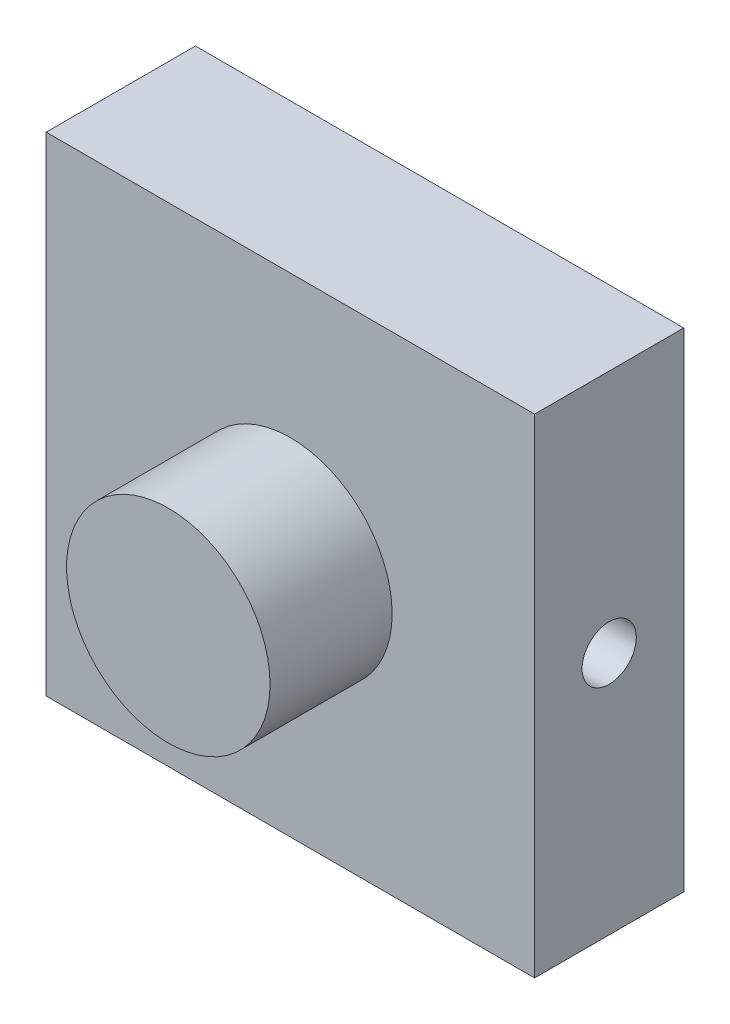
ISO-10303-21;
HEADER;
FILE_DESCRIPTION(('STEP AP214'),'2;1');
FILE_NAME('part.step','',(''),(''),'','','');
FILE_SCHEMA(('AUTOMOTIVE_DESIGN { 1 0 10303 214 1 1 1 1 }'));
ENDSEC;
DATA;
#1=APPLICATION_CONTEXT('core data for automotive mechanical design processes');
#2=APPLICATION_PROTOCOL_DEFINITION('international standard','automotive_design',2000,#1);
#3=PRODUCT_CONTEXT('',#1,'mechanical');
#4=PRODUCT('Part','Part','',(#3));
#5=PRODUCT_RELATED_PRODUCT_CATEGORY('part','',(#4));
#6=PRODUCT_DEFINITION_FORMATION('','',#4);
#7=PRODUCT_DEFINITION_CONTEXT('part definition',#1,'design');
#8=PRODUCT_DEFINITION('design','',#6,#7);
#9=PRODUCT_DEFINITION_SHAPE('','',#8);
#10=(LENGTH_UNIT() NAMED_UNIT(*) SI_UNIT(.MILLI.,.METRE.));
#11=(NAMED_UNIT(*) PLANE_ANGLE_UNIT() SI_UNIT($,.RADIAN.));
#12=(NAMED_UNIT(*) SI_UNIT($,.STERADIAN.) SOLID_ANGLE_UNIT());
#13=UNCERTAINTY_MEASURE_WITH_UNIT(LENGTH_MEASURE(1.E-05),#10,'distance_accuracy_value','');
#14=(GEOMETRIC_REPRESENTATION_CONTEXT(3) GLOBAL_UNCERTAINTY_ASSIGNED_CONTEXT((#13)) GLOBAL_UNIT_ASSIGNED_CONTEXT((#10,
#11,#12)) REPRESENTATION_CONTEXT('',''));
#15=CARTESIAN_POINT('',(0.,0.,0.));
#16=DIRECTION('',(0.,0.,1.));
#17=DIRECTION('',(1.,0.,0.));
#18=AXIS2_PLACEMENT_3D('',#15,#16,#17);
#19=CARTESIAN_POINT('',(0.,0.,11.));
#20=DIRECTION('',(0.,1.,0.));
#21=DIRECTION('',(0.,0.,1.));
#22=AXIS2_PLACEMENT_3D('',#19,#20,#21);
#23=PLANE('',#22);
#24=DIRECTION('',(1.,0.,0.));
#25=VECTOR('',#24,1.);
#26=CARTESIAN_POINT('',(0.,0.,0.));
#27=LINE('',#26,#25);
#28=CARTESIAN_POINT('',(0.,0.,0.));
#29=VERTEX_POINT('',#28);
#30=CARTESIAN_POINT('',(36.,0.,0.));
#31=VERTEX_POINT('',#30);
#32=EDGE_CURVE('E101',#29,#31,#27,.T.);
#33=ORIENTED_EDGE('',*,*,#32,.T.);
#34=DIRECTION('',(0.,0.,-1.));
#35=VECTOR('',#34,1.);
#36=CARTESIAN_POINT('',(36.,0.,11.));
#37=LINE('',#36,#35);
#38=CARTESIAN_POINT('',(36.,0.,11.));
#39=VERTEX_POINT('',#38);
#40=EDGE_CURVE('E38',#39,#31,#37,.T.);
#41=ORIENTED_EDGE('',*,*,#40,.F.);
#42=DIRECTION('',(1.,0.,0.));
#43=VECTOR('',#42,1.);
#44=CARTESIAN_POINT('',(0.,0.,11.));
#45=LINE('',#44,#43);
#46=CARTESIAN_POINT('',(0.,0.,11.));
#47=VERTEX_POINT('',#46);
#48=EDGE_CURVE('E86',#47,#39,#45,.T.);
#49=ORIENTED_EDGE('',*,*,#48,.F.);
#50=DIRECTION('',(0.,0.,-1.));
#51=VECTOR('',#50,1.);
#52=CARTESIAN_POINT('',(0.,0.,11.));
#53=LINE('',#52,#51);
#54=EDGE_CURVE('E52',#47,#29,#53,.T.);
#55=ORIENTED_EDGE('',*,*,#54,.T.);
#56=EDGE_LOOP('',(#33,#41,#49,#55));
#57=FACE_BOUND('',#56,.T.);
#58=ADVANCED_FACE('F35',(#57),#23,.F.);
#59=CARTESIAN_POINT('',(36.,0.,11.));
#60=DIRECTION('',(-1.,0.,0.));
#61=DIRECTION('',(0.,0.,1.));
#62=AXIS2_PLACEMENT_3D('',#59,#60,#61);
#63=PLANE('',#62);
#64=CARTESIAN_POINT('',(36.,18.,5.5));
#65=DIRECTION('',(1.,0.,0.));
#66=DIRECTION('',(0.,0.,-1.));
#67=AXIS2_PLACEMENT_3D('',#64,#65,#66);
#68=CIRCLE('',#67,2.);
#69=CARTESIAN_POINT('',(36.,18.,3.5));
#70=VERTEX_POINT('',#69);
#71=EDGE_CURVE('E116',#70,#70,#68,.T.);
#72=ORIENTED_EDGE('',*,*,#71,.F.);
#73=EDGE_LOOP('',(#72));
#74=FACE_BOUND('',#73,.T.);
#75=DIRECTION('',(0.,1.,0.));
#76=VECTOR('',#75,1.);
#77=CARTESIAN_POINT('',(36.,0.,0.));
#78=LINE('',#77,#76);
#79=CARTESIAN_POINT('',(36.,36.,0.));
#80=VERTEX_POINT('',#79);
#81=EDGE_CURVE('E92',#31,#80,#78,.T.);
#82=ORIENTED_EDGE('',*,*,#81,.T.);
#83=DIRECTION('',(0.,0.,-1.));
#84=VECTOR('',#83,1.);
#85=CARTESIAN_POINT('',(36.,36.,11.));
#86=LINE('',#85,#84);
#87=CARTESIAN_POINT('',(36.,36.,11.));
#88=VERTEX_POINT('',#87);
#89=EDGE_CURVE('E90',#88,#80,#86,.T.);
#90=ORIENTED_EDGE('',*,*,#89,.F.);
#91=DIRECTION('',(0.,1.,0.));
#92=VECTOR('',#91,1.);
#93=CARTESIAN_POINT('',(36.,0.,11.));
#94=LINE('',#93,#92);
#95=EDGE_CURVE('E78',#39,#88,#94,.T.);
#96=ORIENTED_EDGE('',*,*,#95,.F.);
#97=ORIENTED_EDGE('',*,*,#40,.T.);
#98=EDGE_LOOP('',(#82,#90,#96,#97));
#99=FACE_BOUND('',#98,.T.);
#100=ADVANCED_FACE('F91',(#74,#99),#63,.F.);
#101=CARTESIAN_POINT('',(0.,36.,11.));
#102=DIRECTION('',(0.,1.,0.));
#103=DIRECTION('',(0.,0.,1.));
#104=AXIS2_PLACEMENT_3D('',#101,#102,#103);
#105=PLANE('',#104);
#106=DIRECTION('',(1.,0.,0.));
#107=VECTOR('',#106,1.);
#108=CARTESIAN_POINT('',(0.,36.,0.));
#109=LINE('',#108,#107);
#110=CARTESIAN_POINT('',(0.,36.,0.));
#111=VERTEX_POINT('',#110);
#112=EDGE_CURVE('E105',#111,#80,#109,.T.);
#113=ORIENTED_EDGE('',*,*,#112,.F.);
#114=DIRECTION('',(0.,0.,-1.));
#115=VECTOR('',#114,1.);
#116=CARTESIAN_POINT('',(0.,36.,11.));
#117=LINE('',#116,#115);
#118=CARTESIAN_POINT('',(0.,36.,11.));
#119=VERTEX_POINT('',#118);
#120=EDGE_CURVE('E66',#119,#111,#117,.T.);
#121=ORIENTED_EDGE('',*,*,#120,.F.);
#122=DIRECTION('',(1.,0.,0.));
#123=VECTOR('',#122,1.);
#124=CARTESIAN_POINT('',(0.,36.,11.));
#125=LINE('',#124,#123);
#126=EDGE_CURVE('E85',#119,#88,#125,.T.);
#127=ORIENTED_EDGE('',*,*,#126,.T.);
#128=ORIENTED_EDGE('',*,*,#89,.T.);
#129=EDGE_LOOP('',(#113,#121,#127,#128));
#130=FACE_BOUND('',#129,.T.);
#131=ADVANCED_FACE('F95',(#130),#105,.T.);
#132=CARTESIAN_POINT('',(0.,0.,11.));
#133=DIRECTION('',(-1.,0.,0.));
#134=DIRECTION('',(0.,0.,1.));
#135=AXIS2_PLACEMENT_3D('',#132,#133,#134);
#136=PLANE('',#135);
#137=CARTESIAN_POINT('',(0.,18.,5.5));
#138=DIRECTION('',(-1.,0.,0.));
#139=DIRECTION('',(0.,0.,1.));
#140=AXIS2_PLACEMENT_3D('',#137,#138,#139);
#141=CIRCLE('',#140,2.);
#142=CARTESIAN_POINT('',(0.,18.,7.5));
#143=VERTEX_POINT('',#142);
#144=EDGE_CURVE('E122',#143,#143,#141,.T.);
#145=ORIENTED_EDGE('',*,*,#144,.F.);
#146=EDGE_LOOP('',(#145));
#147=FACE_BOUND('',#146,.T.);
#148=DIRECTION('',(0.,1.,0.));
#149=VECTOR('',#148,1.);
#150=CARTESIAN_POINT('',(0.,0.,0.));
#151=LINE('',#150,#149);
#152=EDGE_CURVE('E107',#29,#111,#151,.T.);
#153=ORIENTED_EDGE('',*,*,#152,.F.);
#154=ORIENTED_EDGE('',*,*,#54,.F.);
#155=DIRECTION('',(0.,1.,0.));
#156=VECTOR('',#155,1.);
#157=CARTESIAN_POINT('',(0.,0.,11.));
#158=LINE('',#157,#156);
#159=EDGE_CURVE('E96',#47,#119,#158,.T.);
#160=ORIENTED_EDGE('',*,*,#159,.T.);
#161=ORIENTED_EDGE('',*,*,#120,.T.);
#162=EDGE_LOOP('',(#153,#154,#160,#161));
#163=FACE_BOUND('',#162,.T.);
#164=ADVANCED_FACE('F137',(#147,#163),#136,.T.);
#165=CARTESIAN_POINT('',(0.,0.,11.));
#166=DIRECTION('',(0.,0.,1.));
#167=DIRECTION('',(1.,0.,0.));
#168=AXIS2_PLACEMENT_3D('',#165,#166,#167);
#169=PLANE('',#168);
#170=CARTESIAN_POINT('',(18.,18.,11.));
#171=DIRECTION('',(0.,0.,1.));
#172=DIRECTION('',(1.,0.,0.));
#173=AXIS2_PLACEMENT_3D('',#170,#171,#172);
#174=CIRCLE('',#173,7.5);
#175=CARTESIAN_POINT('',(25.5,18.,11.));
#176=VERTEX_POINT('',#175);
#177=EDGE_CURVE('E11',#176,#176,#174,.T.);
#178=ORIENTED_EDGE('',*,*,#177,.F.);
#179=EDGE_LOOP('',(#178));
#180=FACE_BOUND('',#179,.T.);
#181=ORIENTED_EDGE('',*,*,#48,.T.);
#182=ORIENTED_EDGE('',*,*,#95,.T.);
#183=ORIENTED_EDGE('',*,*,#126,.F.);
#184=ORIENTED_EDGE('',*,*,#159,.F.);
#185=EDGE_LOOP('',(#181,#182,#183,#184));
#186=FACE_BOUND('',#185,.T.);
#187=ADVANCED_FACE('F82',(#180,#186),#169,.T.);
#188=CARTESIAN_POINT('',(0.,0.,0.));
#189=DIRECTION('',(0.,0.,1.));
#190=DIRECTION('',(1.,0.,0.));
#191=AXIS2_PLACEMENT_3D('',#188,#189,#190);
#192=PLANE('',#191);
#193=ORIENTED_EDGE('',*,*,#32,.F.);
#194=ORIENTED_EDGE('',*,*,#152,.T.);
#195=ORIENTED_EDGE('',*,*,#112,.T.);
#196=ORIENTED_EDGE('',*,*,#81,.F.);
#197=EDGE_LOOP('',(#193,#194,#195,#196));
#198=FACE_BOUND('',#197,.T.);
#199=ADVANCED_FACE('F144',(#198),#192,.F.);
#200=CARTESIAN_POINT('',(18.,18.,20.));
#201=DIRECTION('',(0.,0.,-1.));
#202=DIRECTION('',(-1.,0.,0.));
#203=AXIS2_PLACEMENT_3D('',#200,#201,#202);
#204=CYLINDRICAL_SURFACE('',#203,7.5);
#205=CARTESIAN_POINT('',(18.,18.,20.));
#206=DIRECTION('',(0.,0.,1.));
#207=DIRECTION('',(1.,0.,0.));
#208=AXIS2_PLACEMENT_3D('',#205,#206,#207);
#209=CIRCLE('',#208,7.5);
#210=CARTESIAN_POINT('',(25.5,18.,20.));
#211=VERTEX_POINT('',#210);
#212=EDGE_CURVE('E103',#211,#211,#209,.T.);
#213=ORIENTED_EDGE('',*,*,#212,.F.);
#214=EDGE_LOOP('',(#213));
#215=FACE_BOUND('',#214,.T.);
#216=ORIENTED_EDGE('',*,*,#177,.T.);
#217=EDGE_LOOP('',(#216));
#218=FACE_BOUND('',#217,.T.);
#219=ADVANCED_FACE('F155',(#215,#218),#204,.T.);
#220=CARTESIAN_POINT('',(18.,18.,20.));
#221=DIRECTION('',(0.,0.,1.));
#222=DIRECTION('',(1.,0.,0.));
#223=AXIS2_PLACEMENT_3D('',#220,#221,#222);
#224=PLANE('',#223);
#225=ORIENTED_EDGE('',*,*,#212,.T.);
#226=EDGE_LOOP('',(#225));
#227=FACE_BOUND('',#226,.T.);
#228=ADVANCED_FACE('F159',(#227),#224,.T.);
#229=CARTESIAN_POINT('',(33.,18.,5.5));
#230=DIRECTION('',(1.,0.,0.));
#231=DIRECTION('',(0.,0.,-1.));
#232=AXIS2_PLACEMENT_3D('',#229,#230,#231);
#233=CYLINDRICAL_SURFACE('',#232,2.);
#234=CARTESIAN_POINT('',(33.,18.,5.5));
#235=DIRECTION('',(1.,0.,0.));
#236=DIRECTION('',(0.,0.,-1.));
#237=AXIS2_PLACEMENT_3D('',#234,#235,#236);
#238=CIRCLE('',#237,2.);
#239=CARTESIAN_POINT('',(33.,18.,3.5));
#240=VERTEX_POINT('',#239);
#241=EDGE_CURVE('E115',#240,#240,#238,.T.);
#242=ORIENTED_EDGE('',*,*,#241,.F.);
#243=EDGE_LOOP('',(#242));
#244=FACE_BOUND('',#243,.T.);
#245=ORIENTED_EDGE('',*,*,#71,.T.);
#246=EDGE_LOOP('',(#245));
#247=FACE_BOUND('',#246,.T.);
#248=ADVANCED_FACE('F165',(#244,#247),#233,.F.);
#249=CARTESIAN_POINT('',(33.,18.,5.5));
#250=DIRECTION('',(1.,0.,0.));
#251=DIRECTION('',(0.,0.,-1.));
#252=AXIS2_PLACEMENT_3D('',#249,#250,#251);
#253=PLANE('',#252);
#254=ORIENTED_EDGE('',*,*,#241,.T.);
#255=EDGE_LOOP('',(#254));
#256=FACE_BOUND('',#255,.T.);
#257=ADVANCED_FACE('F133',(#256),#253,.T.);
#258=CARTESIAN_POINT('',(3.,18.,5.5));
#259=DIRECTION('',(-1.,0.,0.));
#260=DIRECTION('',(0.,0.,1.));
#261=AXIS2_PLACEMENT_3D('',#258,#259,#260);
#262=CYLINDRICAL_SURFACE('',#261,2.);
#263=CARTESIAN_POINT('',(3.,18.,5.5));
#264=DIRECTION('',(-1.,0.,0.));
#265=DIRECTION('',(0.,0.,1.));
#266=AXIS2_PLACEMENT_3D('',#263,#264,#265);
#267=CIRCLE('',#266,2.);
#268=CARTESIAN_POINT('',(3.,18.,7.5));
#269=VERTEX_POINT('',#268);
#270=EDGE_CURVE('E119',#269,#269,#267,.T.);
#271=ORIENTED_EDGE('',*,*,#270,.F.);
#272=EDGE_LOOP('',(#271));
#273=FACE_BOUND('',#272,.T.);
#274=ORIENTED_EDGE('',*,*,#144,.T.);
#275=EDGE_LOOP('',(#274));
#276=FACE_BOUND('',#275,.T.);
#277=ADVANCED_FACE('F130',(#273,#276),#262,.F.);
#278=CARTESIAN_POINT('',(3.,18.,5.5));
#279=DIRECTION('',(-1.,0.,0.));
#280=DIRECTION('',(0.,0.,1.));
#281=AXIS2_PLACEMENT_3D('',#278,#279,#280);
#282=PLANE('',#281);
#283=ORIENTED_EDGE('',*,*,#270,.T.);
#284=EDGE_LOOP('',(#283));
#285=FACE_BOUND('',#284,.T.);
#286=ADVANCED_FACE('F128',(#285),#282,.T.);
#287=CLOSED_SHELL('',(#58,#100,#131,#164,#187,#199,#219,#228,#248,#257,#277,#286));
#288=MANIFOLD_SOLID_BREP('B2',#287);
#289=ADVANCED_BREP_SHAPE_REPRESENTATION('',(#18,#288),#14);
#290=SHAPE_DEFINITION_REPRESENTATION(#9,#289);
ENDSEC;
END-ISO-10303-21;
